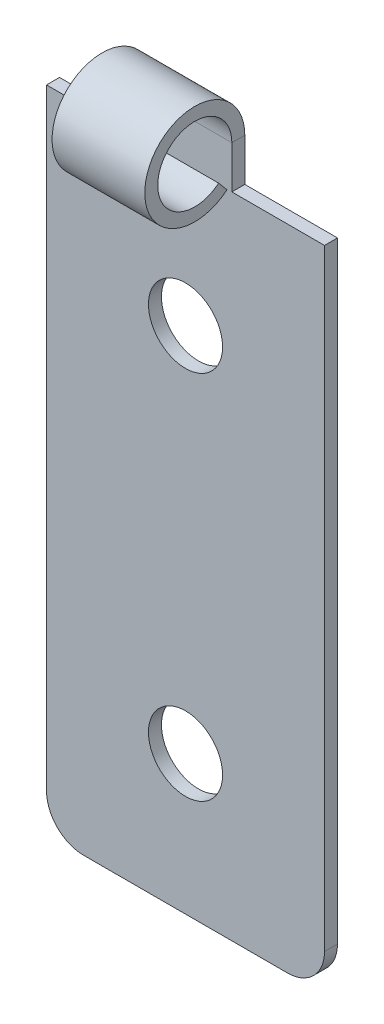
ISO-10303-21;
HEADER;
FILE_DESCRIPTION(('STEP AP214'),'2;1');
FILE_NAME('part.step','',(''),(''),'','','');
FILE_SCHEMA(('AUTOMOTIVE_DESIGN { 1 0 10303 214 1 1 1 1 }'));
ENDSEC;
DATA;
#1=APPLICATION_CONTEXT('core data for automotive mechanical design processes');
#2=APPLICATION_PROTOCOL_DEFINITION('international standard','automotive_design',2000,#1);
#3=PRODUCT_CONTEXT('',#1,'mechanical');
#4=PRODUCT('Part','Part','',(#3));
#5=PRODUCT_RELATED_PRODUCT_CATEGORY('part','',(#4));
#6=PRODUCT_DEFINITION_FORMATION('','',#4);
#7=PRODUCT_DEFINITION_CONTEXT('part definition',#1,'design');
#8=PRODUCT_DEFINITION('design','',#6,#7);
#9=PRODUCT_DEFINITION_SHAPE('','',#8);
#10=(LENGTH_UNIT() NAMED_UNIT(*) SI_UNIT(.MILLI.,.METRE.));
#11=(NAMED_UNIT(*) PLANE_ANGLE_UNIT() SI_UNIT($,.RADIAN.));
#12=(NAMED_UNIT(*) SI_UNIT($,.STERADIAN.) SOLID_ANGLE_UNIT());
#13=UNCERTAINTY_MEASURE_WITH_UNIT(LENGTH_MEASURE(1.E-05),#10,'distance_accuracy_value','');
#14=(GEOMETRIC_REPRESENTATION_CONTEXT(3) GLOBAL_UNCERTAINTY_ASSIGNED_CONTEXT((#13)) GLOBAL_UNIT_ASSIGNED_CONTEXT((#10,
#11,#12)) REPRESENTATION_CONTEXT('',''));
#15=CARTESIAN_POINT('',(0.,0.,0.));
#16=DIRECTION('',(0.,0.,1.));
#17=DIRECTION('',(1.,0.,0.));
#18=AXIS2_PLACEMENT_3D('',#15,#16,#17);
#19=CARTESIAN_POINT('',(5.,5.,-0.7));
#20=DIRECTION('',(-1.,0.,0.));
#21=DIRECTION('',(0.,0.,1.));
#22=AXIS2_PLACEMENT_3D('',#19,#20,#21);
#23=PLANE('',#22);
#24=DIRECTION('',(0.,-1.,0.));
#25=VECTOR('',#24,1.);
#26=CARTESIAN_POINT('',(5.,5.,0.));
#27=LINE('',#26,#25);
#28=CARTESIAN_POINT('',(5.,2.3,0.));
#29=VERTEX_POINT('',#28);
#30=CARTESIAN_POINT('',(5.,0.,0.));
#31=VERTEX_POINT('',#30);
#32=EDGE_CURVE('E217',#29,#31,#27,.T.);
#33=ORIENTED_EDGE('',*,*,#32,.F.);
#34=DIRECTION('',(0.,0.,-1.));
#35=VECTOR('',#34,1.);
#36=CARTESIAN_POINT('',(5.,2.3,0.));
#37=LINE('',#36,#35);
#38=CARTESIAN_POINT('',(5.,2.3,-0.7));
#39=VERTEX_POINT('',#38);
#40=EDGE_CURVE('E57',#29,#39,#37,.T.);
#41=ORIENTED_EDGE('',*,*,#40,.T.);
#42=DIRECTION('',(0.,-1.,0.));
#43=VECTOR('',#42,1.);
#44=CARTESIAN_POINT('',(5.,5.,-0.7));
#45=LINE('',#44,#43);
#46=CARTESIAN_POINT('',(5.,0.,-0.7));
#47=VERTEX_POINT('',#46);
#48=EDGE_CURVE('E141',#39,#47,#45,.T.);
#49=ORIENTED_EDGE('',*,*,#48,.T.);
#50=DIRECTION('',(0.,0.,1.));
#51=VECTOR('',#50,1.);
#52=CARTESIAN_POINT('',(5.,0.,-0.7));
#53=LINE('',#52,#51);
#54=EDGE_CURVE('E256',#47,#31,#53,.T.);
#55=ORIENTED_EDGE('',*,*,#54,.T.);
#56=EDGE_LOOP('',(#33,#41,#49,#55));
#57=FACE_BOUND('',#56,.T.);
#58=ADVANCED_FACE('F41',(#57),#23,.T.);
#59=CARTESIAN_POINT('',(5.,0.,-0.7));
#60=DIRECTION('',(0.,1.,0.));
#61=DIRECTION('',(0.,0.,1.));
#62=AXIS2_PLACEMENT_3D('',#59,#60,#61);
#63=PLANE('',#62);
#64=DIRECTION('',(-1.,0.,0.));
#65=VECTOR('',#64,1.);
#66=CARTESIAN_POINT('',(5.,0.,0.));
#67=LINE('',#66,#65);
#68=CARTESIAN_POINT('',(0.,0.,0.));
#69=VERTEX_POINT('',#68);
#70=EDGE_CURVE('E211',#31,#69,#67,.T.);
#71=ORIENTED_EDGE('',*,*,#70,.F.);
#72=ORIENTED_EDGE('',*,*,#54,.F.);
#73=DIRECTION('',(-1.,0.,0.));
#74=VECTOR('',#73,1.);
#75=CARTESIAN_POINT('',(5.,0.,-0.7));
#76=LINE('',#75,#74);
#77=CARTESIAN_POINT('',(0.,0.,-0.7));
#78=VERTEX_POINT('',#77);
#79=EDGE_CURVE('E212',#47,#78,#76,.T.);
#80=ORIENTED_EDGE('',*,*,#79,.T.);
#81=DIRECTION('',(0.,0.,1.));
#82=VECTOR('',#81,1.);
#83=CARTESIAN_POINT('',(0.,0.,-0.7));
#84=LINE('',#83,#82);
#85=EDGE_CURVE('E232',#78,#69,#84,.T.);
#86=ORIENTED_EDGE('',*,*,#85,.T.);
#87=EDGE_LOOP('',(#71,#72,#80,#86));
#88=FACE_BOUND('',#87,.T.);
#89=ADVANCED_FACE('F322',(#88),#63,.T.);
#90=CARTESIAN_POINT('',(10.,0.,-0.7));
#91=DIRECTION('',(1.,0.,0.));
#92=DIRECTION('',(0.,0.,-1.));
#93=AXIS2_PLACEMENT_3D('',#90,#91,#92);
#94=PLANE('',#93);
#95=DIRECTION('',(0.,0.,-1.));
#96=VECTOR('',#95,1.);
#97=CARTESIAN_POINT('',(10.,2.3,0.));
#98=LINE('',#97,#96);
#99=CARTESIAN_POINT('',(10.,2.3,0.));
#100=VERTEX_POINT('',#99);
#101=CARTESIAN_POINT('',(10.,2.3,-0.7));
#102=VERTEX_POINT('',#101);
#103=EDGE_CURVE('E135',#100,#102,#98,.T.);
#104=ORIENTED_EDGE('',*,*,#103,.F.);
#105=DIRECTION('',(0.,1.,0.));
#106=VECTOR('',#105,1.);
#107=CARTESIAN_POINT('',(10.,0.,0.));
#108=LINE('',#107,#106);
#109=CARTESIAN_POINT('',(10.,0.,0.));
#110=VERTEX_POINT('',#109);
#111=EDGE_CURVE('E251',#110,#100,#108,.T.);
#112=ORIENTED_EDGE('',*,*,#111,.F.);
#113=DIRECTION('',(0.,0.,1.));
#114=VECTOR('',#113,1.);
#115=CARTESIAN_POINT('',(10.,0.,-0.7));
#116=LINE('',#115,#114);
#117=CARTESIAN_POINT('',(10.,0.,-0.7));
#118=VERTEX_POINT('',#117);
#119=EDGE_CURVE('E136',#118,#110,#116,.T.);
#120=ORIENTED_EDGE('',*,*,#119,.F.);
#121=DIRECTION('',(0.,1.,0.));
#122=VECTOR('',#121,1.);
#123=CARTESIAN_POINT('',(10.,0.,-0.7));
#124=LINE('',#123,#122);
#125=EDGE_CURVE('E130',#118,#102,#124,.T.);
#126=ORIENTED_EDGE('',*,*,#125,.T.);
#127=EDGE_LOOP('',(#104,#112,#120,#126));
#128=FACE_BOUND('',#127,.T.);
#129=ADVANCED_FACE('F132',(#128),#94,.T.);
#130=CARTESIAN_POINT('',(15.,0.,-0.7));
#131=DIRECTION('',(0.,1.,0.));
#132=DIRECTION('',(-1.,0.,0.));
#133=AXIS2_PLACEMENT_3D('',#130,#131,#132);
#134=PLANE('',#133);
#135=DIRECTION('',(-1.,0.,0.));
#136=VECTOR('',#135,1.);
#137=CARTESIAN_POINT('',(15.,0.,0.));
#138=LINE('',#137,#136);
#139=CARTESIAN_POINT('',(15.,0.,0.));
#140=VERTEX_POINT('',#139);
#141=EDGE_CURVE('E247',#140,#110,#138,.T.);
#142=ORIENTED_EDGE('',*,*,#141,.F.);
#143=DIRECTION('',(0.,0.,1.));
#144=VECTOR('',#143,1.);
#145=CARTESIAN_POINT('',(15.,0.,-0.7));
#146=LINE('',#145,#144);
#147=CARTESIAN_POINT('',(15.,0.,-0.7));
#148=VERTEX_POINT('',#147);
#149=EDGE_CURVE('E263',#148,#140,#146,.T.);
#150=ORIENTED_EDGE('',*,*,#149,.F.);
#151=DIRECTION('',(-1.,0.,0.));
#152=VECTOR('',#151,1.);
#153=CARTESIAN_POINT('',(15.,0.,-0.7));
#154=LINE('',#153,#152);
#155=EDGE_CURVE('E142',#148,#118,#154,.T.);
#156=ORIENTED_EDGE('',*,*,#155,.T.);
#157=ORIENTED_EDGE('',*,*,#119,.T.);
#158=EDGE_LOOP('',(#142,#150,#156,#157));
#159=FACE_BOUND('',#158,.T.);
#160=ADVANCED_FACE('F314',(#159),#134,.T.);
#161=CARTESIAN_POINT('',(15.,-35.,-0.7));
#162=DIRECTION('',(1.,0.,0.));
#163=DIRECTION('',(0.,1.,0.));
#164=AXIS2_PLACEMENT_3D('',#161,#162,#163);
#165=PLANE('',#164);
#166=DIRECTION('',(0.,1.,0.));
#167=VECTOR('',#166,1.);
#168=CARTESIAN_POINT('',(15.,-35.,0.));
#169=LINE('',#168,#167);
#170=CARTESIAN_POINT('',(15.,-33.,0.));
#171=VERTEX_POINT('',#170);
#172=EDGE_CURVE('E244',#171,#140,#169,.T.);
#173=ORIENTED_EDGE('',*,*,#172,.F.);
#174=DIRECTION('',(0.,0.,1.));
#175=VECTOR('',#174,1.);
#176=CARTESIAN_POINT('',(15.,-33.,-0.7));
#177=LINE('',#176,#175);
#178=CARTESIAN_POINT('',(15.,-33.,-0.7));
#179=VERTEX_POINT('',#178);
#180=EDGE_CURVE('E11',#171,#179,#177,.F.);
#181=ORIENTED_EDGE('',*,*,#180,.T.);
#182=DIRECTION('',(0.,1.,0.));
#183=VECTOR('',#182,1.);
#184=CARTESIAN_POINT('',(15.,-35.,-0.7));
#185=LINE('',#184,#183);
#186=EDGE_CURVE('E225',#179,#148,#185,.T.);
#187=ORIENTED_EDGE('',*,*,#186,.T.);
#188=ORIENTED_EDGE('',*,*,#149,.T.);
#189=EDGE_LOOP('',(#173,#181,#187,#188));
#190=FACE_BOUND('',#189,.T.);
#191=ADVANCED_FACE('F309',(#190),#165,.T.);
#192=CARTESIAN_POINT('',(0.,-35.,-0.7));
#193=DIRECTION('',(0.,-1.,0.));
#194=DIRECTION('',(0.,0.,-1.));
#195=AXIS2_PLACEMENT_3D('',#192,#193,#194);
#196=PLANE('',#195);
#197=DIRECTION('',(1.,0.,0.));
#198=VECTOR('',#197,1.);
#199=CARTESIAN_POINT('',(0.,-35.,0.));
#200=LINE('',#199,#198);
#201=CARTESIAN_POINT('',(2.,-35.,0.));
#202=VERTEX_POINT('',#201);
#203=CARTESIAN_POINT('',(13.,-35.,0.));
#204=VERTEX_POINT('',#203);
#205=EDGE_CURVE('E240',#202,#204,#200,.T.);
#206=ORIENTED_EDGE('',*,*,#205,.F.);
#207=DIRECTION('',(0.,0.,1.));
#208=VECTOR('',#207,1.);
#209=CARTESIAN_POINT('',(2.,-35.,-0.7));
#210=LINE('',#209,#208);
#211=CARTESIAN_POINT('',(2.,-35.,-0.7));
#212=VERTEX_POINT('',#211);
#213=EDGE_CURVE('E282',#202,#212,#210,.F.);
#214=ORIENTED_EDGE('',*,*,#213,.T.);
#215=DIRECTION('',(1.,0.,0.));
#216=VECTOR('',#215,1.);
#217=CARTESIAN_POINT('',(0.,-35.,-0.7));
#218=LINE('',#217,#216);
#219=CARTESIAN_POINT('',(13.,-35.,-0.7));
#220=VERTEX_POINT('',#219);
#221=EDGE_CURVE('E221',#212,#220,#218,.T.);
#222=ORIENTED_EDGE('',*,*,#221,.T.);
#223=DIRECTION('',(0.,0.,1.));
#224=VECTOR('',#223,1.);
#225=CARTESIAN_POINT('',(13.,-35.,-0.7));
#226=LINE('',#225,#224);
#227=EDGE_CURVE('E278',#220,#204,#226,.T.);
#228=ORIENTED_EDGE('',*,*,#227,.T.);
#229=EDGE_LOOP('',(#206,#214,#222,#228));
#230=FACE_BOUND('',#229,.T.);
#231=ADVANCED_FACE('F302',(#230),#196,.T.);
#232=CARTESIAN_POINT('',(0.,0.,-0.7));
#233=DIRECTION('',(-1.,0.,0.));
#234=DIRECTION('',(0.,-1.,0.));
#235=AXIS2_PLACEMENT_3D('',#232,#233,#234);
#236=PLANE('',#235);
#237=DIRECTION('',(0.,-1.,0.));
#238=VECTOR('',#237,1.);
#239=CARTESIAN_POINT('',(0.,0.,-0.7));
#240=LINE('',#239,#238);
#241=CARTESIAN_POINT('',(0.,-33.,-0.7));
#242=VERTEX_POINT('',#241);
#243=EDGE_CURVE('E216',#78,#242,#240,.T.);
#244=ORIENTED_EDGE('',*,*,#243,.T.);
#245=DIRECTION('',(0.,0.,1.));
#246=VECTOR('',#245,1.);
#247=CARTESIAN_POINT('',(0.,-33.,-0.7));
#248=LINE('',#247,#246);
#249=CARTESIAN_POINT('',(0.,-33.,0.));
#250=VERTEX_POINT('',#249);
#251=EDGE_CURVE('E260',#242,#250,#248,.T.);
#252=ORIENTED_EDGE('',*,*,#251,.T.);
#253=DIRECTION('',(0.,-1.,0.));
#254=VECTOR('',#253,1.);
#255=CARTESIAN_POINT('',(0.,0.,0.));
#256=LINE('',#255,#254);
#257=EDGE_CURVE('E236',#69,#250,#256,.T.);
#258=ORIENTED_EDGE('',*,*,#257,.F.);
#259=ORIENTED_EDGE('',*,*,#85,.F.);
#260=EDGE_LOOP('',(#244,#252,#258,#259));
#261=FACE_BOUND('',#260,.T.);
#262=ADVANCED_FACE('F295',(#261),#236,.T.);
#263=CARTESIAN_POINT('',(0.,0.,-0.7));
#264=DIRECTION('',(0.,0.,1.));
#265=DIRECTION('',(1.,0.,0.));
#266=AXIS2_PLACEMENT_3D('',#263,#264,#265);
#267=PLANE('',#266);
#268=CARTESIAN_POINT('',(7.5,-7.5,-0.699999999999999));
#269=DIRECTION('',(0.,0.,1.));
#270=DIRECTION('',(1.,0.,0.));
#271=AXIS2_PLACEMENT_3D('',#268,#269,#270);
#272=CIRCLE('',#271,2.);
#273=CARTESIAN_POINT('',(9.5,-7.5,-0.699999999999999));
#274=VERTEX_POINT('',#273);
#275=EDGE_CURVE('E207',#274,#274,#272,.T.);
#276=ORIENTED_EDGE('',*,*,#275,.T.);
#277=EDGE_LOOP('',(#276));
#278=FACE_BOUND('',#277,.T.);
#279=CARTESIAN_POINT('',(7.5,-27.5,-0.699999999999999));
#280=DIRECTION('',(0.,0.,1.));
#281=DIRECTION('',(1.,0.,0.));
#282=AXIS2_PLACEMENT_3D('',#279,#280,#281);
#283=CIRCLE('',#282,2.);
#284=CARTESIAN_POINT('',(9.5,-27.5,-0.699999999999999));
#285=VERTEX_POINT('',#284);
#286=EDGE_CURVE('E200',#285,#285,#283,.T.);
#287=ORIENTED_EDGE('',*,*,#286,.T.);
#288=EDGE_LOOP('',(#287));
#289=FACE_BOUND('',#288,.T.);
#290=ORIENTED_EDGE('',*,*,#48,.F.);
#291=DIRECTION('',(-1.,0.,0.));
#292=VECTOR('',#291,1.);
#293=CARTESIAN_POINT('',(5.,2.3,-0.7));
#294=LINE('',#293,#292);
#295=EDGE_CURVE('E145',#39,#102,#294,.F.);
#296=ORIENTED_EDGE('',*,*,#295,.T.);
#297=ORIENTED_EDGE('',*,*,#125,.F.);
#298=ORIENTED_EDGE('',*,*,#155,.F.);
#299=ORIENTED_EDGE('',*,*,#186,.F.);
#300=CARTESIAN_POINT('',(13.,-33.,-0.7));
#301=DIRECTION('',(0.,0.,1.));
#302=DIRECTION('',(1.,0.,0.));
#303=AXIS2_PLACEMENT_3D('',#300,#301,#302);
#304=CIRCLE('',#303,2.);
#305=EDGE_CURVE('E285',#179,#220,#304,.F.);
#306=ORIENTED_EDGE('',*,*,#305,.T.);
#307=ORIENTED_EDGE('',*,*,#221,.F.);
#308=CARTESIAN_POINT('',(2.,-33.,-0.7));
#309=DIRECTION('',(0.,0.,1.));
#310=DIRECTION('',(1.,0.,0.));
#311=AXIS2_PLACEMENT_3D('',#308,#309,#310);
#312=CIRCLE('',#311,2.);
#313=EDGE_CURVE('E50',#212,#242,#312,.F.);
#314=ORIENTED_EDGE('',*,*,#313,.T.);
#315=ORIENTED_EDGE('',*,*,#243,.F.);
#316=ORIENTED_EDGE('',*,*,#79,.F.);
#317=EDGE_LOOP('',(#290,#296,#297,#298,#299,#306,#307,#314,#315,#316));
#318=FACE_BOUND('',#317,.T.);
#319=ADVANCED_FACE('F146',(#278,#289,#318),#267,.F.);
#320=CARTESIAN_POINT('',(0.,0.,0.));
#321=DIRECTION('',(0.,0.,1.));
#322=DIRECTION('',(1.,0.,0.));
#323=AXIS2_PLACEMENT_3D('',#320,#321,#322);
#324=PLANE('',#323);
#325=DIRECTION('',(-1.,0.,0.));
#326=VECTOR('',#325,1.);
#327=CARTESIAN_POINT('',(5.,2.3,0.));
#328=LINE('',#327,#326);
#329=EDGE_CURVE('E65',#29,#100,#328,.F.);
#330=ORIENTED_EDGE('',*,*,#329,.F.);
#331=ORIENTED_EDGE('',*,*,#32,.T.);
#332=ORIENTED_EDGE('',*,*,#70,.T.);
#333=ORIENTED_EDGE('',*,*,#257,.T.);
#334=CARTESIAN_POINT('',(2.,-33.,0.));
#335=DIRECTION('',(0.,0.,1.));
#336=DIRECTION('',(1.,0.,0.));
#337=AXIS2_PLACEMENT_3D('',#334,#335,#336);
#338=CIRCLE('',#337,2.);
#339=EDGE_CURVE('E275',#250,#202,#338,.T.);
#340=ORIENTED_EDGE('',*,*,#339,.T.);
#341=ORIENTED_EDGE('',*,*,#205,.T.);
#342=CARTESIAN_POINT('',(13.,-33.,0.));
#343=DIRECTION('',(0.,0.,1.));
#344=DIRECTION('',(1.,0.,0.));
#345=AXIS2_PLACEMENT_3D('',#342,#343,#344);
#346=CIRCLE('',#345,2.);
#347=EDGE_CURVE('E272',#204,#171,#346,.T.);
#348=ORIENTED_EDGE('',*,*,#347,.T.);
#349=ORIENTED_EDGE('',*,*,#172,.T.);
#350=ORIENTED_EDGE('',*,*,#141,.T.);
#351=ORIENTED_EDGE('',*,*,#111,.T.);
#352=EDGE_LOOP('',(#330,#331,#332,#333,#340,#341,#348,#349,#350,#351));
#353=FACE_BOUND('',#352,.T.);
#354=CARTESIAN_POINT('',(7.5,-7.5,0.));
#355=DIRECTION('',(0.,0.,1.));
#356=DIRECTION('',(1.,0.,0.));
#357=AXIS2_PLACEMENT_3D('',#354,#355,#356);
#358=CIRCLE('',#357,2.);
#359=CARTESIAN_POINT('',(9.5,-7.5,0.));
#360=VERTEX_POINT('',#359);
#361=EDGE_CURVE('E196',#360,#360,#358,.T.);
#362=ORIENTED_EDGE('',*,*,#361,.F.);
#363=EDGE_LOOP('',(#362));
#364=FACE_BOUND('',#363,.T.);
#365=CARTESIAN_POINT('',(7.5,-27.5,0.));
#366=DIRECTION('',(0.,0.,1.));
#367=DIRECTION('',(-1.,0.,0.));
#368=AXIS2_PLACEMENT_3D('',#365,#366,#367);
#369=CIRCLE('',#368,2.);
#370=CARTESIAN_POINT('',(5.50000000000001,-27.5,0.));
#371=VERTEX_POINT('',#370);
#372=EDGE_CURVE('E194',#371,#371,#369,.T.);
#373=ORIENTED_EDGE('',*,*,#372,.F.);
#374=EDGE_LOOP('',(#373));
#375=FACE_BOUND('',#374,.T.);
#376=ADVANCED_FACE('F299',(#353,#364,#375),#324,.T.);
#377=CARTESIAN_POINT('',(2.,-33.,-0.7));
#378=DIRECTION('',(0.,0.,1.));
#379=DIRECTION('',(1.,0.,0.));
#380=AXIS2_PLACEMENT_3D('',#377,#378,#379);
#381=CYLINDRICAL_SURFACE('',#380,2.);
#382=ORIENTED_EDGE('',*,*,#313,.F.);
#383=ORIENTED_EDGE('',*,*,#213,.F.);
#384=ORIENTED_EDGE('',*,*,#339,.F.);
#385=ORIENTED_EDGE('',*,*,#251,.F.);
#386=EDGE_LOOP('',(#382,#383,#384,#385));
#387=FACE_BOUND('',#386,.T.);
#388=ADVANCED_FACE('F297',(#387),#381,.T.);
#389=CARTESIAN_POINT('',(13.,-33.,-0.7));
#390=DIRECTION('',(0.,0.,1.));
#391=DIRECTION('',(1.,0.,0.));
#392=AXIS2_PLACEMENT_3D('',#389,#390,#391);
#393=CYLINDRICAL_SURFACE('',#392,2.);
#394=ORIENTED_EDGE('',*,*,#305,.F.);
#395=ORIENTED_EDGE('',*,*,#180,.F.);
#396=ORIENTED_EDGE('',*,*,#347,.F.);
#397=ORIENTED_EDGE('',*,*,#227,.F.);
#398=EDGE_LOOP('',(#394,#395,#396,#397));
#399=FACE_BOUND('',#398,.T.);
#400=ADVANCED_FACE('F43',(#399),#393,.T.);
#401=CARTESIAN_POINT('',(7.5,-27.5,-10.));
#402=DIRECTION('',(0.,0.,1.));
#403=DIRECTION('',(1.,0.,0.));
#404=AXIS2_PLACEMENT_3D('',#401,#402,#403);
#405=CYLINDRICAL_SURFACE('',#404,2.);
#406=ORIENTED_EDGE('',*,*,#372,.T.);
#407=EDGE_LOOP('',(#406));
#408=FACE_BOUND('',#407,.T.);
#409=ORIENTED_EDGE('',*,*,#286,.F.);
#410=EDGE_LOOP('',(#409));
#411=FACE_BOUND('',#410,.T.);
#412=ADVANCED_FACE('F337',(#408,#411),#405,.F.);
#413=CARTESIAN_POINT('',(7.5,-7.5,-10.));
#414=DIRECTION('',(0.,0.,1.));
#415=DIRECTION('',(1.,0.,0.));
#416=AXIS2_PLACEMENT_3D('',#413,#414,#415);
#417=CYLINDRICAL_SURFACE('',#416,2.);
#418=ORIENTED_EDGE('',*,*,#361,.T.);
#419=EDGE_LOOP('',(#418));
#420=FACE_BOUND('',#419,.T.);
#421=ORIENTED_EDGE('',*,*,#275,.F.);
#422=EDGE_LOOP('',(#421));
#423=FACE_BOUND('',#422,.T.);
#424=ADVANCED_FACE('F340',(#420,#423),#417,.F.);
#425=CARTESIAN_POINT('',(7.5,0.767911113762059,0.714424780626903));
#426=DIRECTION('',(0.,-0.642787609686549,0.76604444311897));
#427=DIRECTION('',(-1.,0.,0.));
#428=AXIS2_PLACEMENT_3D('',#425,#426,#427);
#429=PLANE('',#428);
#430=DIRECTION('',(0.,-0.76604444311897,-0.642787609686549));
#431=VECTOR('',#430,1.);
#432=CARTESIAN_POINT('',(5.,0.767911113762059,0.714424780626903));
#433=LINE('',#432,#431);
#434=CARTESIAN_POINT('',(5.,0.767911113762059,0.714424780626903));
#435=VERTEX_POINT('',#434);
#436=CARTESIAN_POINT('',(5.,0.23168000357878,0.264473453846319));
#437=VERTEX_POINT('',#436);
#438=EDGE_CURVE('E192',#435,#437,#433,.T.);
#439=ORIENTED_EDGE('',*,*,#438,.F.);
#440=DIRECTION('',(-1.,0.,0.));
#441=VECTOR('',#440,1.);
#442=CARTESIAN_POINT('',(5.,0.767911113762059,0.714424780626903));
#443=LINE('',#442,#441);
#444=CARTESIAN_POINT('',(10.,0.767911113762059,0.714424780626903));
#445=VERTEX_POINT('',#444);
#446=EDGE_CURVE('E186',#445,#435,#443,.T.);
#447=ORIENTED_EDGE('',*,*,#446,.F.);
#448=DIRECTION('',(0.,-0.76604444311897,-0.642787609686549));
#449=VECTOR('',#448,1.);
#450=CARTESIAN_POINT('',(10.,0.767911113762059,0.714424780626903));
#451=LINE('',#450,#449);
#452=CARTESIAN_POINT('',(10.,0.23168000357878,0.264473453846319));
#453=VERTEX_POINT('',#452);
#454=EDGE_CURVE('E163',#445,#453,#451,.T.);
#455=ORIENTED_EDGE('',*,*,#454,.T.);
#456=DIRECTION('',(-1.,0.,0.));
#457=VECTOR('',#456,1.);
#458=CARTESIAN_POINT('',(5.,0.23168000357878,0.264473453846319));
#459=LINE('',#458,#457);
#460=EDGE_CURVE('E168',#453,#437,#459,.T.);
#461=ORIENTED_EDGE('',*,*,#460,.T.);
#462=EDGE_LOOP('',(#439,#447,#455,#461));
#463=FACE_BOUND('',#462,.T.);
#464=ADVANCED_FACE('F344',(#463),#429,.F.);
#465=CARTESIAN_POINT('',(10.,2.3,2.));
#466=DIRECTION('',(1.,0.,0.));
#467=DIRECTION('',(0.,0.,-1.));
#468=AXIS2_PLACEMENT_3D('',#465,#466,#467);
#469=PLANE('',#468);
#470=ORIENTED_EDGE('',*,*,#454,.F.);
#471=CARTESIAN_POINT('',(10.,2.3,2.));
#472=DIRECTION('',(-1.,0.,0.));
#473=DIRECTION('',(0.,0.,1.));
#474=AXIS2_PLACEMENT_3D('',#471,#472,#473);
#475=CIRCLE('',#474,2.);
#476=EDGE_CURVE('E161',#100,#445,#475,.F.);
#477=ORIENTED_EDGE('',*,*,#476,.F.);
#478=ORIENTED_EDGE('',*,*,#103,.T.);
#479=CARTESIAN_POINT('',(10.,2.3,2.));
#480=DIRECTION('',(-1.,0.,0.));
#481=DIRECTION('',(0.,0.,1.));
#482=AXIS2_PLACEMENT_3D('',#479,#480,#481);
#483=CIRCLE('',#482,2.7);
#484=EDGE_CURVE('E153',#102,#453,#483,.F.);
#485=ORIENTED_EDGE('',*,*,#484,.T.);
#486=EDGE_LOOP('',(#470,#477,#478,#485));
#487=FACE_BOUND('',#486,.T.);
#488=ADVANCED_FACE('F159',(#487),#469,.T.);
#489=CARTESIAN_POINT('',(5.,2.3,2.));
#490=DIRECTION('',(1.,0.,0.));
#491=DIRECTION('',(0.,0.,-1.));
#492=AXIS2_PLACEMENT_3D('',#489,#490,#491);
#493=PLANE('',#492);
#494=CARTESIAN_POINT('',(5.,2.3,2.));
#495=DIRECTION('',(-1.,0.,0.));
#496=DIRECTION('',(0.,0.,1.));
#497=AXIS2_PLACEMENT_3D('',#494,#495,#496);
#498=CIRCLE('',#497,2.);
#499=EDGE_CURVE('E182',#435,#29,#498,.T.);
#500=ORIENTED_EDGE('',*,*,#499,.F.);
#501=ORIENTED_EDGE('',*,*,#438,.T.);
#502=CARTESIAN_POINT('',(5.,2.3,2.));
#503=DIRECTION('',(-1.,0.,0.));
#504=DIRECTION('',(0.,0.,1.));
#505=AXIS2_PLACEMENT_3D('',#502,#503,#504);
#506=CIRCLE('',#505,2.7);
#507=EDGE_CURVE('E154',#437,#39,#506,.T.);
#508=ORIENTED_EDGE('',*,*,#507,.T.);
#509=ORIENTED_EDGE('',*,*,#40,.F.);
#510=EDGE_LOOP('',(#500,#501,#508,#509));
#511=FACE_BOUND('',#510,.T.);
#512=ADVANCED_FACE('F346',(#511),#493,.F.);
#513=CARTESIAN_POINT('',(5.,2.3,2.));
#514=DIRECTION('',(-1.,0.,0.));
#515=DIRECTION('',(0.,-0.76604444311897,-0.642787609686549));
#516=AXIS2_PLACEMENT_3D('',#513,#514,#515);
#517=CYLINDRICAL_SURFACE('',#516,2.7);
#518=ORIENTED_EDGE('',*,*,#295,.F.);
#519=ORIENTED_EDGE('',*,*,#507,.F.);
#520=ORIENTED_EDGE('',*,*,#460,.F.);
#521=ORIENTED_EDGE('',*,*,#484,.F.);
#522=EDGE_LOOP('',(#518,#519,#520,#521));
#523=FACE_BOUND('',#522,.T.);
#524=ADVANCED_FACE('F166',(#523),#517,.T.);
#525=CARTESIAN_POINT('',(5.,2.3,2.));
#526=DIRECTION('',(-1.,0.,0.));
#527=DIRECTION('',(0.,-0.76604444311897,-0.642787609686549));
#528=AXIS2_PLACEMENT_3D('',#525,#526,#527);
#529=CYLINDRICAL_SURFACE('',#528,2.);
#530=ORIENTED_EDGE('',*,*,#329,.T.);
#531=ORIENTED_EDGE('',*,*,#476,.T.);
#532=ORIENTED_EDGE('',*,*,#446,.T.);
#533=ORIENTED_EDGE('',*,*,#499,.T.);
#534=EDGE_LOOP('',(#530,#531,#532,#533));
#535=FACE_BOUND('',#534,.T.);
#536=ADVANCED_FACE('F355',(#535),#529,.F.);
#537=CLOSED_SHELL('',(#58,#89,#129,#160,#191,#231,#262,#319,#376,#388,#400,#412,#424,#464,#488,
#512,#524,#536));
#538=MANIFOLD_SOLID_BREP('B2',#537);
#539=ADVANCED_BREP_SHAPE_REPRESENTATION('',(#18,#538),#14);
#540=SHAPE_DEFINITION_REPRESENTATION(#9,#539);
ENDSEC;
END-ISO-10303-21;
